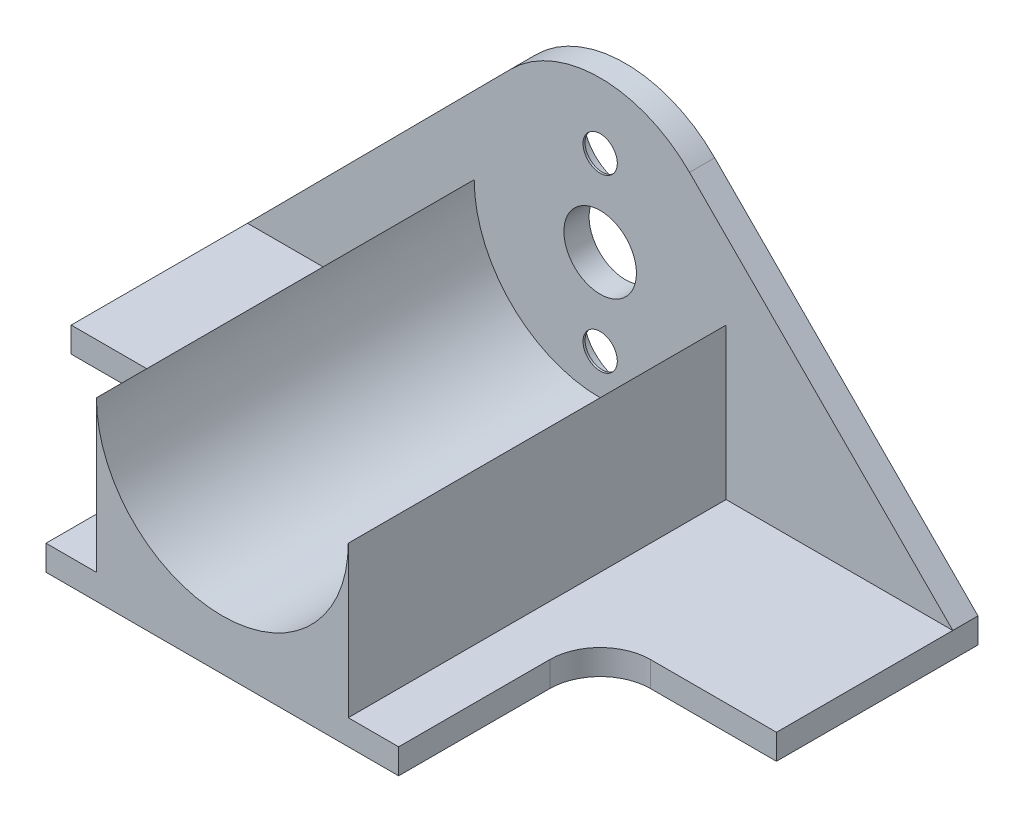
ISO-10303-21;
HEADER;
FILE_DESCRIPTION(('STEP AP214'),'2;1');
FILE_NAME('part.step','',(''),(''),'','','');
FILE_SCHEMA(('AUTOMOTIVE_DESIGN { 1 0 10303 214 1 1 1 1 }'));
ENDSEC;
DATA;
#1=APPLICATION_CONTEXT('core data for automotive mechanical design processes');
#2=APPLICATION_PROTOCOL_DEFINITION('international standard','automotive_design',2000,#1);
#3=PRODUCT_CONTEXT('',#1,'mechanical');
#4=PRODUCT('Part','Part','',(#3));
#5=PRODUCT_RELATED_PRODUCT_CATEGORY('part','',(#4));
#6=PRODUCT_DEFINITION_FORMATION('','',#4);
#7=PRODUCT_DEFINITION_CONTEXT('part definition',#1,'design');
#8=PRODUCT_DEFINITION('design','',#6,#7);
#9=PRODUCT_DEFINITION_SHAPE('','',#8);
#10=(LENGTH_UNIT() NAMED_UNIT(*) SI_UNIT(.MILLI.,.METRE.));
#11=(NAMED_UNIT(*) PLANE_ANGLE_UNIT() SI_UNIT($,.RADIAN.));
#12=(NAMED_UNIT(*) SI_UNIT($,.STERADIAN.) SOLID_ANGLE_UNIT());
#13=UNCERTAINTY_MEASURE_WITH_UNIT(LENGTH_MEASURE(1.E-05),#10,'distance_accuracy_value','');
#14=(GEOMETRIC_REPRESENTATION_CONTEXT(3) GLOBAL_UNCERTAINTY_ASSIGNED_CONTEXT((#13)) GLOBAL_UNIT_ASSIGNED_CONTEXT((#10,
#11,#12)) REPRESENTATION_CONTEXT('',''));
#15=CARTESIAN_POINT('',(0.,0.,0.));
#16=DIRECTION('',(0.,0.,1.));
#17=DIRECTION('',(1.,0.,0.));
#18=AXIS2_PLACEMENT_3D('',#15,#16,#17);
#19=CARTESIAN_POINT('',(-35.,32.5,-7.49999999999999));
#20=DIRECTION('',(0.,0.,-1.));
#21=DIRECTION('',(-1.,0.,0.));
#22=AXIS2_PLACEMENT_3D('',#19,#20,#21);
#23=PLANE('',#22);
#24=CARTESIAN_POINT('',(0.,26.,-7.49999999999999));
#25=DIRECTION('',(0.,0.,-1.));
#26=DIRECTION('',(-1.,0.,0.));
#27=AXIS2_PLACEMENT_3D('',#24,#25,#26);
#28=CIRCLE('',#27,1.69999999999999);
#29=CARTESIAN_POINT('',(-1.69999999999999,26.,-7.49999999999999));
#30=VERTEX_POINT('',#29);
#31=EDGE_CURVE('E67',#30,#30,#28,.T.);
#32=ORIENTED_EDGE('',*,*,#31,.T.);
#33=EDGE_LOOP('',(#32));
#34=FACE_BOUND('',#33,.T.);
#35=CARTESIAN_POINT('',(0.,9.,-7.49999999999999));
#36=DIRECTION('',(0.,0.,-1.));
#37=DIRECTION('',(-1.,0.,0.));
#38=AXIS2_PLACEMENT_3D('',#35,#36,#37);
#39=CIRCLE('',#38,1.69999999999999);
#40=CARTESIAN_POINT('',(-1.69999999999999,9.,-7.49999999999999));
#41=VERTEX_POINT('',#40);
#42=EDGE_CURVE('E355',#41,#41,#39,.T.);
#43=ORIENTED_EDGE('',*,*,#42,.T.);
#44=EDGE_LOOP('',(#43));
#45=FACE_BOUND('',#44,.T.);
#46=CARTESIAN_POINT('',(0.,17.5,-7.49999999999999));
#47=DIRECTION('',(0.,0.,1.));
#48=DIRECTION('',(1.,0.,0.));
#49=AXIS2_PLACEMENT_3D('',#46,#47,#48);
#50=CIRCLE('',#49,3.6);
#51=CARTESIAN_POINT('',(3.6,17.5,-7.49999999999999));
#52=VERTEX_POINT('',#51);
#53=EDGE_CURVE('E365',#52,#52,#50,.T.);
#54=ORIENTED_EDGE('',*,*,#53,.F.);
#55=EDGE_LOOP('',(#54));
#56=FACE_BOUND('',#55,.T.);
#57=DIRECTION('',(0.,1.,0.));
#58=VECTOR('',#57,1.);
#59=CARTESIAN_POINT('',(12.5,17.5,-7.49999999999999));
#60=LINE('',#59,#58);
#61=CARTESIAN_POINT('',(12.5,2.5,-7.49999999999999));
#62=VERTEX_POINT('',#61);
#63=CARTESIAN_POINT('',(12.5,17.5,-7.49999999999999));
#64=VERTEX_POINT('',#63);
#65=EDGE_CURVE('E387',#62,#64,#60,.T.);
#66=ORIENTED_EDGE('',*,*,#65,.F.);
#67=DIRECTION('',(1.,0.,0.));
#68=VECTOR('',#67,1.);
#69=CARTESIAN_POINT('',(-35.,2.5,-7.49999999999999));
#70=LINE('',#69,#68);
#71=CARTESIAN_POINT('',(35.,2.5,-7.49999999999999));
#72=VERTEX_POINT('',#71);
#73=EDGE_CURVE('E204',#62,#72,#70,.T.);
#74=ORIENTED_EDGE('',*,*,#73,.T.);
#75=DIRECTION('',(-0.704708398525219,0.709497056405466,0.));
#76=VECTOR('',#75,1.);
#77=CARTESIAN_POINT('',(18.8684838926254,18.7411335206048,-7.49999999999999));
#78=LINE('',#77,#76);
#79=CARTESIAN_POINT('',(8.86871320506833,28.8088549815652,-7.49999999999999));
#80=VERTEX_POINT('',#79);
#81=EDGE_CURVE('E225',#72,#80,#78,.T.);
#82=ORIENTED_EDGE('',*,*,#81,.T.);
#83=CARTESIAN_POINT('',(0.,20.,-7.49999999999999));
#84=DIRECTION('',(0.,0.,1.));
#85=DIRECTION('',(1.,0.,0.));
#86=AXIS2_PLACEMENT_3D('',#83,#84,#85);
#87=CIRCLE('',#86,12.5);
#88=CARTESIAN_POINT('',(-8.86871320506833,28.8088549815652,-7.49999999999999));
#89=VERTEX_POINT('',#88);
#90=EDGE_CURVE('E248',#80,#89,#87,.T.);
#91=ORIENTED_EDGE('',*,*,#90,.T.);
#92=DIRECTION('',(0.704708398525219,0.709497056405467,0.));
#93=VECTOR('',#92,1.);
#94=CARTESIAN_POINT('',(-18.8684838926254,18.7411335206048,-7.49999999999999));
#95=LINE('',#94,#93);
#96=CARTESIAN_POINT('',(-35.,2.5,-7.49999999999999));
#97=VERTEX_POINT('',#96);
#98=EDGE_CURVE('E252',#97,#89,#95,.T.);
#99=ORIENTED_EDGE('',*,*,#98,.F.);
#100=CARTESIAN_POINT('',(-12.5,2.5,-7.49999999999999));
#101=VERTEX_POINT('',#100);
#102=EDGE_CURVE('E262',#97,#101,#70,.T.);
#103=ORIENTED_EDGE('',*,*,#102,.T.);
#104=DIRECTION('',(0.,-1.,0.));
#105=VECTOR('',#104,1.);
#106=CARTESIAN_POINT('',(-12.5,17.5,-7.49999999999999));
#107=LINE('',#106,#105);
#108=CARTESIAN_POINT('',(-12.5,17.5,-7.49999999999999));
#109=VERTEX_POINT('',#108);
#110=EDGE_CURVE('E81',#109,#101,#107,.T.);
#111=ORIENTED_EDGE('',*,*,#110,.F.);
#112=CARTESIAN_POINT('',(0.,17.5,-7.49999999999999));
#113=DIRECTION('',(0.,0.,-1.));
#114=DIRECTION('',(1.,0.,0.));
#115=AXIS2_PLACEMENT_3D('',#112,#113,#114);
#116=CIRCLE('',#115,12.5);
#117=EDGE_CURVE('E86',#64,#109,#116,.T.);
#118=ORIENTED_EDGE('',*,*,#117,.F.);
#119=EDGE_LOOP('',(#66,#74,#82,#91,#99,#103,#111,#118));
#120=FACE_BOUND('',#119,.T.);
#121=ADVANCED_FACE('F63',(#34,#45,#56,#120),#23,.F.);
#122=CARTESIAN_POINT('',(0.,2.5,0.));
#123=DIRECTION('',(0.,1.,0.));
#124=DIRECTION('',(0.,0.,1.));
#125=AXIS2_PLACEMENT_3D('',#122,#123,#124);
#126=PLANE('',#125);
#127=ORIENTED_EDGE('',*,*,#73,.F.);
#128=DIRECTION('',(0.,0.,-1.));
#129=VECTOR('',#128,1.);
#130=CARTESIAN_POINT('',(12.5,2.49999999999999,59.1547594742265));
#131=LINE('',#130,#129);
#132=CARTESIAN_POINT('',(12.5,2.49999999999999,30.));
#133=VERTEX_POINT('',#132);
#134=EDGE_CURVE('E201',#133,#62,#131,.T.);
#135=ORIENTED_EDGE('',*,*,#134,.F.);
#136=DIRECTION('',(1.,0.,0.));
#137=VECTOR('',#136,1.);
#138=CARTESIAN_POINT('',(0.,2.5,30.));
#139=LINE('',#138,#137);
#140=CARTESIAN_POINT('',(17.5,2.5,30.));
#141=VERTEX_POINT('',#140);
#142=EDGE_CURVE('E183',#133,#141,#139,.T.);
#143=ORIENTED_EDGE('',*,*,#142,.T.);
#144=DIRECTION('',(0.,0.,-1.));
#145=VECTOR('',#144,1.);
#146=CARTESIAN_POINT('',(17.5,2.5,0.));
#147=LINE('',#146,#145);
#148=CARTESIAN_POINT('',(17.5,2.5,15.));
#149=VERTEX_POINT('',#148);
#150=EDGE_CURVE('E267',#141,#149,#147,.T.);
#151=ORIENTED_EDGE('',*,*,#150,.T.);
#152=CARTESIAN_POINT('',(22.5,2.5,15.));
#153=DIRECTION('',(0.,1.,0.));
#154=DIRECTION('',(0.,0.,1.));
#155=AXIS2_PLACEMENT_3D('',#152,#153,#154);
#156=CIRCLE('',#155,5.);
#157=CARTESIAN_POINT('',(22.5,2.5,10.));
#158=VERTEX_POINT('',#157);
#159=EDGE_CURVE('E12',#149,#158,#156,.F.);
#160=ORIENTED_EDGE('',*,*,#159,.T.);
#161=DIRECTION('',(1.,0.,0.));
#162=VECTOR('',#161,1.);
#163=CARTESIAN_POINT('',(0.,2.5,10.));
#164=LINE('',#163,#162);
#165=CARTESIAN_POINT('',(35.,2.5,10.));
#166=VERTEX_POINT('',#165);
#167=EDGE_CURVE('E270',#158,#166,#164,.T.);
#168=ORIENTED_EDGE('',*,*,#167,.T.);
#169=DIRECTION('',(0.,0.,-1.));
#170=VECTOR('',#169,1.);
#171=CARTESIAN_POINT('',(35.,2.5,0.));
#172=LINE('',#171,#170);
#173=EDGE_CURVE('E273',#166,#72,#172,.T.);
#174=ORIENTED_EDGE('',*,*,#173,.T.);
#175=EDGE_LOOP('',(#127,#135,#143,#151,#160,#168,#174));
#176=FACE_BOUND('',#175,.T.);
#177=ADVANCED_FACE('F202',(#176),#126,.T.);
#178=CARTESIAN_POINT('',(-17.5,2.5,30.));
#179=VERTEX_POINT('',#178);
#180=CARTESIAN_POINT('',(-12.5,2.5,30.));
#181=VERTEX_POINT('',#180);
#182=EDGE_CURVE('E196',#179,#181,#139,.T.);
#183=ORIENTED_EDGE('',*,*,#182,.T.);
#184=DIRECTION('',(0.,0.,-1.));
#185=VECTOR('',#184,1.);
#186=CARTESIAN_POINT('',(-12.5,2.49999999999999,59.1547594742265));
#187=LINE('',#186,#185);
#188=EDGE_CURVE('E208',#181,#101,#187,.T.);
#189=ORIENTED_EDGE('',*,*,#188,.T.);
#190=ORIENTED_EDGE('',*,*,#102,.F.);
#191=DIRECTION('',(0.,0.,-1.));
#192=VECTOR('',#191,1.);
#193=CARTESIAN_POINT('',(-35.,2.5,0.));
#194=LINE('',#193,#192);
#195=CARTESIAN_POINT('',(-35.,2.5,10.));
#196=VERTEX_POINT('',#195);
#197=EDGE_CURVE('E276',#196,#97,#194,.T.);
#198=ORIENTED_EDGE('',*,*,#197,.F.);
#199=DIRECTION('',(1.,0.,0.));
#200=VECTOR('',#199,1.);
#201=CARTESIAN_POINT('',(0.,2.5,10.));
#202=LINE('',#201,#200);
#203=CARTESIAN_POINT('',(-22.5,2.5,10.));
#204=VERTEX_POINT('',#203);
#205=EDGE_CURVE('E280',#196,#204,#202,.T.);
#206=ORIENTED_EDGE('',*,*,#205,.T.);
#207=CARTESIAN_POINT('',(-22.5,2.5,15.));
#208=DIRECTION('',(0.,1.,0.));
#209=DIRECTION('',(0.,0.,1.));
#210=AXIS2_PLACEMENT_3D('',#207,#208,#209);
#211=CIRCLE('',#210,5.);
#212=CARTESIAN_POINT('',(-17.5,2.5,15.));
#213=VERTEX_POINT('',#212);
#214=EDGE_CURVE('E351',#204,#213,#211,.F.);
#215=ORIENTED_EDGE('',*,*,#214,.T.);
#216=DIRECTION('',(0.,0.,-1.));
#217=VECTOR('',#216,1.);
#218=CARTESIAN_POINT('',(-17.5,2.5,0.));
#219=LINE('',#218,#217);
#220=EDGE_CURVE('E284',#179,#213,#219,.T.);
#221=ORIENTED_EDGE('',*,*,#220,.F.);
#222=EDGE_LOOP('',(#183,#189,#190,#198,#206,#215,#221));
#223=FACE_BOUND('',#222,.T.);
#224=ADVANCED_FACE('F395',(#223),#126,.T.);
#225=CARTESIAN_POINT('',(0.,2.5,-9.99999999999999));
#226=DIRECTION('',(0.,0.,-1.));
#227=DIRECTION('',(-1.,0.,0.));
#228=AXIS2_PLACEMENT_3D('',#225,#226,#227);
#229=PLANE('',#228);
#230=CARTESIAN_POINT('',(0.,26.,-9.99999999999999));
#231=DIRECTION('',(0.,0.,-1.));
#232=DIRECTION('',(-1.,0.,0.));
#233=AXIS2_PLACEMENT_3D('',#230,#231,#232);
#234=CIRCLE('',#233,4.2);
#235=CARTESIAN_POINT('',(-4.2,26.,-9.99999999999999));
#236=VERTEX_POINT('',#235);
#237=EDGE_CURVE('E688',#236,#236,#234,.T.);
#238=ORIENTED_EDGE('',*,*,#237,.F.);
#239=EDGE_LOOP('',(#238));
#240=FACE_BOUND('',#239,.T.);
#241=CARTESIAN_POINT('',(0.,9.,-9.99999999999999));
#242=DIRECTION('',(0.,0.,-1.));
#243=DIRECTION('',(-1.,0.,0.));
#244=AXIS2_PLACEMENT_3D('',#241,#242,#243);
#245=CIRCLE('',#244,4.2);
#246=CARTESIAN_POINT('',(-4.2,9.,-9.99999999999999));
#247=VERTEX_POINT('',#246);
#248=EDGE_CURVE('E374',#247,#247,#245,.T.);
#249=ORIENTED_EDGE('',*,*,#248,.F.);
#250=EDGE_LOOP('',(#249));
#251=FACE_BOUND('',#250,.T.);
#252=CARTESIAN_POINT('',(0.,17.5,-9.99999999999999));
#253=DIRECTION('',(0.,0.,-1.));
#254=DIRECTION('',(-1.,0.,0.));
#255=AXIS2_PLACEMENT_3D('',#252,#253,#254);
#256=CIRCLE('',#255,3.6);
#257=CARTESIAN_POINT('',(-3.6,17.5,-9.99999999999999));
#258=VERTEX_POINT('',#257);
#259=EDGE_CURVE('E358',#258,#258,#256,.F.);
#260=ORIENTED_EDGE('',*,*,#259,.T.);
#261=EDGE_LOOP('',(#260));
#262=FACE_BOUND('',#261,.T.);
#263=CARTESIAN_POINT('',(0.,20.,-9.99999999999999));
#264=DIRECTION('',(0.,0.,-1.));
#265=DIRECTION('',(-1.,0.,0.));
#266=AXIS2_PLACEMENT_3D('',#263,#264,#265);
#267=CIRCLE('',#266,12.5);
#268=CARTESIAN_POINT('',(8.86871320506833,28.8088549815652,-9.99999999999999));
#269=VERTEX_POINT('',#268);
#270=CARTESIAN_POINT('',(-8.86871320506833,28.8088549815652,-9.99999999999999));
#271=VERTEX_POINT('',#270);
#272=EDGE_CURVE('E245',#269,#271,#267,.F.);
#273=ORIENTED_EDGE('',*,*,#272,.F.);
#274=DIRECTION('',(-0.704708398525219,0.709497056405466,0.));
#275=VECTOR('',#274,1.);
#276=CARTESIAN_POINT('',(18.8684838926254,18.7411335206048,-9.99999999999999));
#277=LINE('',#276,#275);
#278=CARTESIAN_POINT('',(35.,2.5,-9.99999999999999));
#279=VERTEX_POINT('',#278);
#280=EDGE_CURVE('E234',#279,#269,#277,.T.);
#281=ORIENTED_EDGE('',*,*,#280,.F.);
#282=DIRECTION('',(0.,-1.,0.));
#283=VECTOR('',#282,1.);
#284=CARTESIAN_POINT('',(35.,2.5,-9.99999999999999));
#285=LINE('',#284,#283);
#286=CARTESIAN_POINT('',(35.,0.,-9.99999999999999));
#287=VERTEX_POINT('',#286);
#288=EDGE_CURVE('E325',#279,#287,#285,.T.);
#289=ORIENTED_EDGE('',*,*,#288,.T.);
#290=DIRECTION('',(1.,0.,0.));
#291=VECTOR('',#290,1.);
#292=CARTESIAN_POINT('',(0.,0.,-9.99999999999999));
#293=LINE('',#292,#291);
#294=CARTESIAN_POINT('',(-35.,0.,-9.99999999999999));
#295=VERTEX_POINT('',#294);
#296=EDGE_CURVE('E302',#295,#287,#293,.T.);
#297=ORIENTED_EDGE('',*,*,#296,.F.);
#298=DIRECTION('',(0.,-1.,0.));
#299=VECTOR('',#298,1.);
#300=CARTESIAN_POINT('',(-35.,2.5,-9.99999999999999));
#301=LINE('',#300,#299);
#302=CARTESIAN_POINT('',(-35.,2.5,-9.99999999999999));
#303=VERTEX_POINT('',#302);
#304=EDGE_CURVE('E322',#303,#295,#301,.T.);
#305=ORIENTED_EDGE('',*,*,#304,.F.);
#306=DIRECTION('',(0.704708398525218,0.709497056405467,0.));
#307=VECTOR('',#306,1.);
#308=CARTESIAN_POINT('',(-18.8684838926254,18.7411335206048,-9.99999999999999));
#309=LINE('',#308,#307);
#310=EDGE_CURVE('E241',#303,#271,#309,.T.);
#311=ORIENTED_EDGE('',*,*,#310,.T.);
#312=EDGE_LOOP('',(#273,#281,#289,#297,#305,#311));
#313=FACE_BOUND('',#312,.T.);
#314=ADVANCED_FACE('F432',(#240,#251,#262,#313),#229,.T.);
#315=CARTESIAN_POINT('',(35.,2.5,0.));
#316=DIRECTION('',(-1.,0.,0.));
#317=DIRECTION('',(0.,0.,1.));
#318=AXIS2_PLACEMENT_3D('',#315,#316,#317);
#319=PLANE('',#318);
#320=DIRECTION('',(0.,0.,1.));
#321=VECTOR('',#320,1.);
#322=CARTESIAN_POINT('',(35.,2.5,-10.001));
#323=LINE('',#322,#321);
#324=EDGE_CURVE('E230',#279,#72,#323,.T.);
#325=ORIENTED_EDGE('',*,*,#324,.T.);
#326=ORIENTED_EDGE('',*,*,#173,.F.);
#327=DIRECTION('',(0.,-1.,0.));
#328=VECTOR('',#327,1.);
#329=CARTESIAN_POINT('',(35.,2.5,10.));
#330=LINE('',#329,#328);
#331=CARTESIAN_POINT('',(35.,0.,10.));
#332=VERTEX_POINT('',#331);
#333=EDGE_CURVE('E328',#166,#332,#330,.T.);
#334=ORIENTED_EDGE('',*,*,#333,.T.);
#335=DIRECTION('',(0.,0.,-1.));
#336=VECTOR('',#335,1.);
#337=CARTESIAN_POINT('',(35.,0.,0.));
#338=LINE('',#337,#336);
#339=EDGE_CURVE('E298',#332,#287,#338,.T.);
#340=ORIENTED_EDGE('',*,*,#339,.T.);
#341=ORIENTED_EDGE('',*,*,#288,.F.);
#342=EDGE_LOOP('',(#325,#326,#334,#340,#341));
#343=FACE_BOUND('',#342,.T.);
#344=ADVANCED_FACE('F415',(#343),#319,.F.);
#345=CARTESIAN_POINT('',(0.,2.5,30.));
#346=DIRECTION('',(0.,0.,-1.));
#347=DIRECTION('',(-1.,0.,0.));
#348=AXIS2_PLACEMENT_3D('',#345,#346,#347);
#349=PLANE('',#348);
#350=DIRECTION('',(1.,0.,0.));
#351=VECTOR('',#350,1.);
#352=CARTESIAN_POINT('',(0.,0.,30.));
#353=LINE('',#352,#351);
#354=CARTESIAN_POINT('',(-17.5,0.,30.));
#355=VERTEX_POINT('',#354);
#356=CARTESIAN_POINT('',(17.5,0.,30.));
#357=VERTEX_POINT('',#356);
#358=EDGE_CURVE('E264',#355,#357,#353,.T.);
#359=ORIENTED_EDGE('',*,*,#358,.T.);
#360=DIRECTION('',(0.,-1.,0.));
#361=VECTOR('',#360,1.);
#362=CARTESIAN_POINT('',(17.5,2.5,30.));
#363=LINE('',#362,#361);
#364=EDGE_CURVE('E191',#141,#357,#363,.T.);
#365=ORIENTED_EDGE('',*,*,#364,.F.);
#366=ORIENTED_EDGE('',*,*,#142,.F.);
#367=DIRECTION('',(0.,-1.,0.));
#368=VECTOR('',#367,1.);
#369=CARTESIAN_POINT('',(12.5,17.5,30.));
#370=LINE('',#369,#368);
#371=CARTESIAN_POINT('',(12.5,17.5,30.));
#372=VERTEX_POINT('',#371);
#373=EDGE_CURVE('E188',#372,#133,#370,.T.);
#374=ORIENTED_EDGE('',*,*,#373,.F.);
#375=CARTESIAN_POINT('',(0.,17.5,30.));
#376=DIRECTION('',(0.,0.,-1.));
#377=DIRECTION('',(-1.,0.,0.));
#378=AXIS2_PLACEMENT_3D('',#375,#376,#377);
#379=CIRCLE('',#378,12.5);
#380=CARTESIAN_POINT('',(-12.5,17.5,30.));
#381=VERTEX_POINT('',#380);
#382=EDGE_CURVE('E220',#381,#372,#379,.F.);
#383=ORIENTED_EDGE('',*,*,#382,.F.);
#384=DIRECTION('',(0.,1.,0.));
#385=VECTOR('',#384,1.);
#386=CARTESIAN_POINT('',(-12.5,17.5,30.));
#387=LINE('',#386,#385);
#388=EDGE_CURVE('E214',#181,#381,#387,.T.);
#389=ORIENTED_EDGE('',*,*,#388,.F.);
#390=ORIENTED_EDGE('',*,*,#182,.F.);
#391=DIRECTION('',(0.,-1.,0.));
#392=VECTOR('',#391,1.);
#393=CARTESIAN_POINT('',(-17.5,2.5,30.));
#394=LINE('',#393,#392);
#395=EDGE_CURVE('E288',#179,#355,#394,.T.);
#396=ORIENTED_EDGE('',*,*,#395,.T.);
#397=EDGE_LOOP('',(#359,#365,#366,#374,#383,#389,#390,#396));
#398=FACE_BOUND('',#397,.T.);
#399=ADVANCED_FACE('F186',(#398),#349,.F.);
#400=CARTESIAN_POINT('',(17.5,2.5,0.));
#401=DIRECTION('',(-1.,0.,0.));
#402=DIRECTION('',(0.,0.,1.));
#403=AXIS2_PLACEMENT_3D('',#400,#401,#402);
#404=PLANE('',#403);
#405=DIRECTION('',(0.,0.,-1.));
#406=VECTOR('',#405,1.);
#407=CARTESIAN_POINT('',(17.5,0.,0.));
#408=LINE('',#407,#406);
#409=CARTESIAN_POINT('',(17.5,0.,15.));
#410=VERTEX_POINT('',#409);
#411=EDGE_CURVE('E291',#357,#410,#408,.T.);
#412=ORIENTED_EDGE('',*,*,#411,.T.);
#413=DIRECTION('',(0.,-1.,0.));
#414=VECTOR('',#413,1.);
#415=CARTESIAN_POINT('',(17.5,2.5,15.));
#416=LINE('',#415,#414);
#417=EDGE_CURVE('E345',#410,#149,#416,.F.);
#418=ORIENTED_EDGE('',*,*,#417,.T.);
#419=ORIENTED_EDGE('',*,*,#150,.F.);
#420=ORIENTED_EDGE('',*,*,#364,.T.);
#421=EDGE_LOOP('',(#412,#418,#419,#420));
#422=FACE_BOUND('',#421,.T.);
#423=ADVANCED_FACE('F453',(#422),#404,.F.);
#424=CARTESIAN_POINT('',(0.,2.5,10.));
#425=DIRECTION('',(0.,0.,-1.));
#426=DIRECTION('',(-1.,0.,0.));
#427=AXIS2_PLACEMENT_3D('',#424,#425,#426);
#428=PLANE('',#427);
#429=ORIENTED_EDGE('',*,*,#167,.F.);
#430=DIRECTION('',(0.,-1.,0.));
#431=VECTOR('',#430,1.);
#432=CARTESIAN_POINT('',(22.5,0.,10.));
#433=LINE('',#432,#431);
#434=CARTESIAN_POINT('',(22.5,0.,10.));
#435=VERTEX_POINT('',#434);
#436=EDGE_CURVE('E341',#158,#435,#433,.T.);
#437=ORIENTED_EDGE('',*,*,#436,.T.);
#438=DIRECTION('',(1.,0.,0.));
#439=VECTOR('',#438,1.);
#440=CARTESIAN_POINT('',(0.,0.,10.));
#441=LINE('',#440,#439);
#442=EDGE_CURVE('E295',#435,#332,#441,.T.);
#443=ORIENTED_EDGE('',*,*,#442,.T.);
#444=ORIENTED_EDGE('',*,*,#333,.F.);
#445=EDGE_LOOP('',(#429,#437,#443,#444));
#446=FACE_BOUND('',#445,.T.);
#447=ADVANCED_FACE('F421',(#446),#428,.F.);
#448=CARTESIAN_POINT('',(-35.,2.5,0.));
#449=DIRECTION('',(-1.,0.,0.));
#450=DIRECTION('',(0.,0.,1.));
#451=AXIS2_PLACEMENT_3D('',#448,#449,#450);
#452=PLANE('',#451);
#453=DIRECTION('',(0.,0.,1.));
#454=VECTOR('',#453,1.);
#455=CARTESIAN_POINT('',(-35.,2.5,-10.001));
#456=LINE('',#455,#454);
#457=EDGE_CURVE('E256',#303,#97,#456,.T.);
#458=ORIENTED_EDGE('',*,*,#457,.F.);
#459=ORIENTED_EDGE('',*,*,#304,.T.);
#460=DIRECTION('',(0.,0.,-1.));
#461=VECTOR('',#460,1.);
#462=CARTESIAN_POINT('',(-35.,0.,0.));
#463=LINE('',#462,#461);
#464=CARTESIAN_POINT('',(-35.,0.,10.));
#465=VERTEX_POINT('',#464);
#466=EDGE_CURVE('E306',#465,#295,#463,.T.);
#467=ORIENTED_EDGE('',*,*,#466,.F.);
#468=DIRECTION('',(0.,-1.,0.));
#469=VECTOR('',#468,1.);
#470=CARTESIAN_POINT('',(-35.,2.5,10.));
#471=LINE('',#470,#469);
#472=EDGE_CURVE('E319',#196,#465,#471,.T.);
#473=ORIENTED_EDGE('',*,*,#472,.F.);
#474=ORIENTED_EDGE('',*,*,#197,.T.);
#475=EDGE_LOOP('',(#458,#459,#467,#473,#474));
#476=FACE_BOUND('',#475,.T.);
#477=ADVANCED_FACE('F440',(#476),#452,.T.);
#478=CARTESIAN_POINT('',(0.,2.5,10.));
#479=DIRECTION('',(0.,0.,-1.));
#480=DIRECTION('',(-1.,0.,0.));
#481=AXIS2_PLACEMENT_3D('',#478,#479,#480);
#482=PLANE('',#481);
#483=DIRECTION('',(1.,0.,0.));
#484=VECTOR('',#483,1.);
#485=CARTESIAN_POINT('',(0.,0.,10.));
#486=LINE('',#485,#484);
#487=CARTESIAN_POINT('',(-22.5,0.,10.));
#488=VERTEX_POINT('',#487);
#489=EDGE_CURVE('E310',#465,#488,#486,.T.);
#490=ORIENTED_EDGE('',*,*,#489,.T.);
#491=DIRECTION('',(0.,-1.,0.));
#492=VECTOR('',#491,1.);
#493=CARTESIAN_POINT('',(-22.5,2.5,10.));
#494=LINE('',#493,#492);
#495=EDGE_CURVE('E338',#488,#204,#494,.F.);
#496=ORIENTED_EDGE('',*,*,#495,.T.);
#497=ORIENTED_EDGE('',*,*,#205,.F.);
#498=ORIENTED_EDGE('',*,*,#472,.T.);
#499=EDGE_LOOP('',(#490,#496,#497,#498));
#500=FACE_BOUND('',#499,.T.);
#501=ADVANCED_FACE('F475',(#500),#482,.F.);
#502=CARTESIAN_POINT('',(-17.5,2.5,0.));
#503=DIRECTION('',(-1.,0.,0.));
#504=DIRECTION('',(0.,0.,1.));
#505=AXIS2_PLACEMENT_3D('',#502,#503,#504);
#506=PLANE('',#505);
#507=ORIENTED_EDGE('',*,*,#220,.T.);
#508=DIRECTION('',(0.,-1.,0.));
#509=VECTOR('',#508,1.);
#510=CARTESIAN_POINT('',(-17.5,2.5,15.));
#511=LINE('',#510,#509);
#512=CARTESIAN_POINT('',(-17.5,0.,15.));
#513=VERTEX_POINT('',#512);
#514=EDGE_CURVE('E334',#213,#513,#511,.T.);
#515=ORIENTED_EDGE('',*,*,#514,.T.);
#516=DIRECTION('',(0.,0.,-1.));
#517=VECTOR('',#516,1.);
#518=CARTESIAN_POINT('',(-17.5,0.,0.));
#519=LINE('',#518,#517);
#520=EDGE_CURVE('E197',#355,#513,#519,.T.);
#521=ORIENTED_EDGE('',*,*,#520,.F.);
#522=ORIENTED_EDGE('',*,*,#395,.F.);
#523=EDGE_LOOP('',(#507,#515,#521,#522));
#524=FACE_BOUND('',#523,.T.);
#525=ADVANCED_FACE('F450',(#524),#506,.T.);
#526=CARTESIAN_POINT('',(0.,0.,0.));
#527=DIRECTION('',(0.,1.,0.));
#528=DIRECTION('',(0.,0.,1.));
#529=AXIS2_PLACEMENT_3D('',#526,#527,#528);
#530=PLANE('',#529);
#531=ORIENTED_EDGE('',*,*,#358,.F.);
#532=ORIENTED_EDGE('',*,*,#520,.T.);
#533=CARTESIAN_POINT('',(-22.5,0.,15.));
#534=DIRECTION('',(0.,1.,0.));
#535=DIRECTION('',(0.,0.,1.));
#536=AXIS2_PLACEMENT_3D('',#533,#534,#535);
#537=CIRCLE('',#536,5.);
#538=EDGE_CURVE('E348',#513,#488,#537,.T.);
#539=ORIENTED_EDGE('',*,*,#538,.T.);
#540=ORIENTED_EDGE('',*,*,#489,.F.);
#541=ORIENTED_EDGE('',*,*,#466,.T.);
#542=ORIENTED_EDGE('',*,*,#296,.T.);
#543=ORIENTED_EDGE('',*,*,#339,.F.);
#544=ORIENTED_EDGE('',*,*,#442,.F.);
#545=CARTESIAN_POINT('',(22.5,0.,15.));
#546=DIRECTION('',(0.,1.,0.));
#547=DIRECTION('',(0.,0.,1.));
#548=AXIS2_PLACEMENT_3D('',#545,#546,#547);
#549=CIRCLE('',#548,5.);
#550=EDGE_CURVE('E73',#435,#410,#549,.T.);
#551=ORIENTED_EDGE('',*,*,#550,.T.);
#552=ORIENTED_EDGE('',*,*,#411,.F.);
#553=EDGE_LOOP('',(#531,#532,#539,#540,#541,#542,#543,#544,#551,#552));
#554=FACE_BOUND('',#553,.T.);
#555=ADVANCED_FACE('F426',(#554),#530,.F.);
#556=CARTESIAN_POINT('',(-22.5,2.5,15.));
#557=DIRECTION('',(0.,-1.,0.));
#558=DIRECTION('',(0.,0.,-1.));
#559=AXIS2_PLACEMENT_3D('',#556,#557,#558);
#560=CYLINDRICAL_SURFACE('',#559,5.);
#561=ORIENTED_EDGE('',*,*,#214,.F.);
#562=ORIENTED_EDGE('',*,*,#495,.F.);
#563=ORIENTED_EDGE('',*,*,#538,.F.);
#564=ORIENTED_EDGE('',*,*,#514,.F.);
#565=EDGE_LOOP('',(#561,#562,#563,#564));
#566=FACE_BOUND('',#565,.T.);
#567=ADVANCED_FACE('F447',(#566),#560,.F.);
#568=CARTESIAN_POINT('',(22.5,2.5,15.));
#569=DIRECTION('',(0.,1.,0.));
#570=DIRECTION('',(0.,0.,1.));
#571=AXIS2_PLACEMENT_3D('',#568,#569,#570);
#572=CYLINDRICAL_SURFACE('',#571,5.);
#573=ORIENTED_EDGE('',*,*,#159,.F.);
#574=ORIENTED_EDGE('',*,*,#417,.F.);
#575=ORIENTED_EDGE('',*,*,#550,.F.);
#576=ORIENTED_EDGE('',*,*,#436,.F.);
#577=EDGE_LOOP('',(#573,#574,#575,#576));
#578=FACE_BOUND('',#577,.T.);
#579=ADVANCED_FACE('F65',(#578),#572,.F.);
#580=CARTESIAN_POINT('',(0.,20.,-10.001));
#581=DIRECTION('',(0.,0.,1.));
#582=DIRECTION('',(1.,0.,0.));
#583=AXIS2_PLACEMENT_3D('',#580,#581,#582);
#584=CYLINDRICAL_SURFACE('',#583,12.5);
#585=ORIENTED_EDGE('',*,*,#272,.T.);
#586=DIRECTION('',(0.,0.,1.));
#587=VECTOR('',#586,1.);
#588=CARTESIAN_POINT('',(-8.86871320506833,28.8088549815652,-10.001));
#589=LINE('',#588,#587);
#590=EDGE_CURVE('E257',#271,#89,#589,.T.);
#591=ORIENTED_EDGE('',*,*,#590,.T.);
#592=ORIENTED_EDGE('',*,*,#90,.F.);
#593=DIRECTION('',(0.,0.,1.));
#594=VECTOR('',#593,1.);
#595=CARTESIAN_POINT('',(8.86871320506833,28.8088549815652,-10.001));
#596=LINE('',#595,#594);
#597=EDGE_CURVE('E229',#269,#80,#596,.T.);
#598=ORIENTED_EDGE('',*,*,#597,.F.);
#599=EDGE_LOOP('',(#585,#591,#592,#598));
#600=FACE_BOUND('',#599,.T.);
#601=ADVANCED_FACE('F435',(#600),#584,.T.);
#602=CARTESIAN_POINT('',(-18.8684838926254,18.7411335206048,-10.001));
#603=DIRECTION('',(0.709497056405467,-0.704708398525218,0.));
#604=DIRECTION('',(0.704708398525218,0.709497056405467,0.));
#605=AXIS2_PLACEMENT_3D('',#602,#603,#604);
#606=PLANE('',#605);
#607=ORIENTED_EDGE('',*,*,#457,.T.);
#608=ORIENTED_EDGE('',*,*,#98,.T.);
#609=ORIENTED_EDGE('',*,*,#590,.F.);
#610=ORIENTED_EDGE('',*,*,#310,.F.);
#611=EDGE_LOOP('',(#607,#608,#609,#610));
#612=FACE_BOUND('',#611,.T.);
#613=ADVANCED_FACE('F437',(#612),#606,.F.);
#614=CARTESIAN_POINT('',(18.8684838926254,18.7411335206048,-10.001));
#615=DIRECTION('',(0.709497056405466,0.704708398525219,0.));
#616=DIRECTION('',(-0.704708398525219,0.709497056405466,0.));
#617=AXIS2_PLACEMENT_3D('',#614,#615,#616);
#618=PLANE('',#617);
#619=ORIENTED_EDGE('',*,*,#280,.T.);
#620=ORIENTED_EDGE('',*,*,#597,.T.);
#621=ORIENTED_EDGE('',*,*,#81,.F.);
#622=ORIENTED_EDGE('',*,*,#324,.F.);
#623=EDGE_LOOP('',(#619,#620,#621,#622));
#624=FACE_BOUND('',#623,.T.);
#625=ADVANCED_FACE('F409',(#624),#618,.T.);
#626=CARTESIAN_POINT('',(12.5,17.5,59.1547594742265));
#627=DIRECTION('',(-1.,0.,0.));
#628=DIRECTION('',(0.,-1.,0.));
#629=AXIS2_PLACEMENT_3D('',#626,#627,#628);
#630=PLANE('',#629);
#631=DIRECTION('',(0.,0.,-1.));
#632=VECTOR('',#631,1.);
#633=CARTESIAN_POINT('',(12.5,17.5,59.1547594742265));
#634=LINE('',#633,#632);
#635=EDGE_CURVE('E209',#372,#64,#634,.T.);
#636=ORIENTED_EDGE('',*,*,#635,.F.);
#637=ORIENTED_EDGE('',*,*,#373,.T.);
#638=ORIENTED_EDGE('',*,*,#134,.T.);
#639=ORIENTED_EDGE('',*,*,#65,.T.);
#640=EDGE_LOOP('',(#636,#637,#638,#639));
#641=FACE_BOUND('',#640,.T.);
#642=ADVANCED_FACE('F212',(#641),#630,.F.);
#643=CARTESIAN_POINT('',(-12.5,17.5,59.1547594742265));
#644=DIRECTION('',(1.,0.,0.));
#645=DIRECTION('',(0.,1.,0.));
#646=AXIS2_PLACEMENT_3D('',#643,#644,#645);
#647=PLANE('',#646);
#648=ORIENTED_EDGE('',*,*,#188,.F.);
#649=ORIENTED_EDGE('',*,*,#388,.T.);
#650=DIRECTION('',(0.,0.,-1.));
#651=VECTOR('',#650,1.);
#652=CARTESIAN_POINT('',(-12.5,17.5,59.1547594742265));
#653=LINE('',#652,#651);
#654=EDGE_CURVE('E215',#381,#109,#653,.T.);
#655=ORIENTED_EDGE('',*,*,#654,.T.);
#656=ORIENTED_EDGE('',*,*,#110,.T.);
#657=EDGE_LOOP('',(#648,#649,#655,#656));
#658=FACE_BOUND('',#657,.T.);
#659=ADVANCED_FACE('F402',(#658),#647,.F.);
#660=CARTESIAN_POINT('',(0.,17.5,59.1547594742265));
#661=DIRECTION('',(0.,0.,-1.));
#662=DIRECTION('',(-1.,0.,0.));
#663=AXIS2_PLACEMENT_3D('',#660,#661,#662);
#664=CYLINDRICAL_SURFACE('',#663,12.5);
#665=ORIENTED_EDGE('',*,*,#654,.F.);
#666=ORIENTED_EDGE('',*,*,#382,.T.);
#667=ORIENTED_EDGE('',*,*,#635,.T.);
#668=ORIENTED_EDGE('',*,*,#117,.T.);
#669=EDGE_LOOP('',(#665,#666,#667,#668));
#670=FACE_BOUND('',#669,.T.);
#671=ADVANCED_FACE('F405',(#670),#664,.F.);
#672=CARTESIAN_POINT('',(0.,17.5,-10.001));
#673=DIRECTION('',(0.,0.,1.));
#674=DIRECTION('',(1.,0.,0.));
#675=AXIS2_PLACEMENT_3D('',#672,#673,#674);
#676=CYLINDRICAL_SURFACE('',#675,3.6);
#677=ORIENTED_EDGE('',*,*,#259,.F.);
#678=EDGE_LOOP('',(#677));
#679=FACE_BOUND('',#678,.T.);
#680=ORIENTED_EDGE('',*,*,#53,.T.);
#681=EDGE_LOOP('',(#680));
#682=FACE_BOUND('',#681,.T.);
#683=ADVANCED_FACE('F608',(#679,#682),#676,.F.);
#684=CARTESIAN_POINT('',(0.,9.,-9.99999999999999));
#685=DIRECTION('',(0.,0.,-1.));
#686=DIRECTION('',(-1.,0.,0.));
#687=AXIS2_PLACEMENT_3D('',#684,#685,#686);
#688=CYLINDRICAL_SURFACE('',#687,1.69999999999999);
#689=CARTESIAN_POINT('',(0.,9.,-7.69999999999999));
#690=DIRECTION('',(0.,0.,-1.));
#691=DIRECTION('',(-1.,0.,0.));
#692=AXIS2_PLACEMENT_3D('',#689,#690,#691);
#693=CIRCLE('',#692,1.7);
#694=CARTESIAN_POINT('',(-1.7,9.,-7.69999999999999));
#695=VERTEX_POINT('',#694);
#696=EDGE_CURVE('E359',#695,#695,#693,.T.);
#697=ORIENTED_EDGE('',*,*,#696,.T.);
#698=EDGE_LOOP('',(#697));
#699=FACE_BOUND('',#698,.T.);
#700=ORIENTED_EDGE('',*,*,#42,.F.);
#701=EDGE_LOOP('',(#700));
#702=FACE_BOUND('',#701,.T.);
#703=ADVANCED_FACE('F615',(#699,#702),#688,.F.);
#704=CARTESIAN_POINT('',(1.7,9.,-7.69999999999999));
#705=DIRECTION('',(0.,0.,1.));
#706=DIRECTION('',(1.,0.,0.));
#707=AXIS2_PLACEMENT_3D('',#704,#705,#706);
#708=PLANE('',#707);
#709=ORIENTED_EDGE('',*,*,#696,.F.);
#710=EDGE_LOOP('',(#709));
#711=FACE_BOUND('',#710,.T.);
#712=CARTESIAN_POINT('',(0.,9.,-7.69999999999999));
#713=DIRECTION('',(0.,0.,-1.));
#714=DIRECTION('',(-1.,0.,0.));
#715=AXIS2_PLACEMENT_3D('',#712,#713,#714);
#716=CIRCLE('',#715,4.2);
#717=CARTESIAN_POINT('',(-4.2,9.,-7.69999999999999));
#718=VERTEX_POINT('',#717);
#719=EDGE_CURVE('E368',#718,#718,#716,.T.);
#720=ORIENTED_EDGE('',*,*,#719,.T.);
#721=EDGE_LOOP('',(#720));
#722=FACE_BOUND('',#721,.T.);
#723=ADVANCED_FACE('F623',(#711,#722),#708,.F.);
#724=CARTESIAN_POINT('',(0.,9.,-9.99999999999999));
#725=DIRECTION('',(0.,0.,-1.));
#726=DIRECTION('',(-1.,0.,0.));
#727=AXIS2_PLACEMENT_3D('',#724,#725,#726);
#728=CYLINDRICAL_SURFACE('',#727,4.2);
#729=ORIENTED_EDGE('',*,*,#719,.F.);
#730=EDGE_LOOP('',(#729));
#731=FACE_BOUND('',#730,.T.);
#732=ORIENTED_EDGE('',*,*,#248,.T.);
#733=EDGE_LOOP('',(#732));
#734=FACE_BOUND('',#733,.T.);
#735=ADVANCED_FACE('F631',(#731,#734),#728,.F.);
#736=CARTESIAN_POINT('',(0.,26.,-9.99999999999999));
#737=DIRECTION('',(0.,0.,-1.));
#738=DIRECTION('',(-1.,0.,0.));
#739=AXIS2_PLACEMENT_3D('',#736,#737,#738);
#740=CYLINDRICAL_SURFACE('',#739,1.69999999999999);
#741=CARTESIAN_POINT('',(0.,26.,-7.69999999999999));
#742=DIRECTION('',(0.,0.,-1.));
#743=DIRECTION('',(-1.,0.,0.));
#744=AXIS2_PLACEMENT_3D('',#741,#742,#743);
#745=CIRCLE('',#744,1.7);
#746=CARTESIAN_POINT('',(-1.7,26.,-7.69999999999999));
#747=VERTEX_POINT('',#746);
#748=EDGE_CURVE('E692',#747,#747,#745,.T.);
#749=ORIENTED_EDGE('',*,*,#748,.T.);
#750=EDGE_LOOP('',(#749));
#751=FACE_BOUND('',#750,.T.);
#752=ORIENTED_EDGE('',*,*,#31,.F.);
#753=EDGE_LOOP('',(#752));
#754=FACE_BOUND('',#753,.T.);
#755=ADVANCED_FACE('F640',(#751,#754),#740,.F.);
#756=CARTESIAN_POINT('',(1.7,26.,-7.69999999999999));
#757=DIRECTION('',(0.,0.,1.));
#758=DIRECTION('',(1.,0.,0.));
#759=AXIS2_PLACEMENT_3D('',#756,#757,#758);
#760=PLANE('',#759);
#761=ORIENTED_EDGE('',*,*,#748,.F.);
#762=EDGE_LOOP('',(#761));
#763=FACE_BOUND('',#762,.T.);
#764=CARTESIAN_POINT('',(0.,26.,-7.69999999999999));
#765=DIRECTION('',(0.,0.,-1.));
#766=DIRECTION('',(-1.,0.,0.));
#767=AXIS2_PLACEMENT_3D('',#764,#765,#766);
#768=CIRCLE('',#767,4.2);
#769=CARTESIAN_POINT('',(-4.2,26.,-7.69999999999999));
#770=VERTEX_POINT('',#769);
#771=EDGE_CURVE('E685',#770,#770,#768,.T.);
#772=ORIENTED_EDGE('',*,*,#771,.T.);
#773=EDGE_LOOP('',(#772));
#774=FACE_BOUND('',#773,.T.);
#775=ADVANCED_FACE('F649',(#763,#774),#760,.F.);
#776=CARTESIAN_POINT('',(0.,26.,-9.99999999999999));
#777=DIRECTION('',(0.,0.,-1.));
#778=DIRECTION('',(-1.,0.,0.));
#779=AXIS2_PLACEMENT_3D('',#776,#777,#778);
#780=CYLINDRICAL_SURFACE('',#779,4.2);
#781=ORIENTED_EDGE('',*,*,#771,.F.);
#782=EDGE_LOOP('',(#781));
#783=FACE_BOUND('',#782,.T.);
#784=ORIENTED_EDGE('',*,*,#237,.T.);
#785=EDGE_LOOP('',(#784));
#786=FACE_BOUND('',#785,.T.);
#787=ADVANCED_FACE('F658',(#783,#786),#780,.F.);
#788=CLOSED_SHELL('',(#121,#177,#224,#314,#344,#399,#423,#447,#477,#501,#525,#555,#567,#579,
#601,#613,#625,#642,#659,#671,#683,#703,#723,#735,#755,#775,#787));
#789=MANIFOLD_SOLID_BREP('B2',#788);
#790=ADVANCED_BREP_SHAPE_REPRESENTATION('',(#18,#789),#14);
#791=SHAPE_DEFINITION_REPRESENTATION(#9,#790);
ENDSEC;
END-ISO-10303-21;
